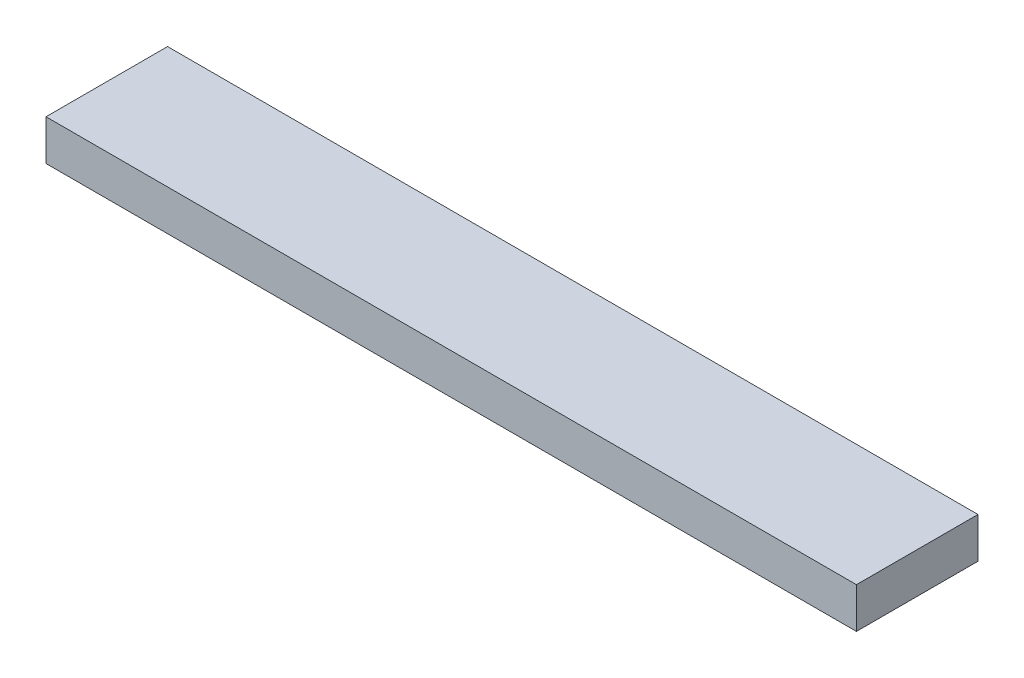
ISO-10303-21;
HEADER;
FILE_DESCRIPTION(('STEP AP214'),'2;1');
FILE_NAME('part.step','',(''),(''),'','','');
FILE_SCHEMA(('AUTOMOTIVE_DESIGN { 1 0 10303 214 1 1 1 1 }'));
ENDSEC;
DATA;
#1=APPLICATION_CONTEXT('core data for automotive mechanical design processes');
#2=APPLICATION_PROTOCOL_DEFINITION('international standard','automotive_design',2000,#1);
#3=PRODUCT_CONTEXT('',#1,'mechanical');
#4=PRODUCT('Part','Part','',(#3));
#5=PRODUCT_RELATED_PRODUCT_CATEGORY('part','',(#4));
#6=PRODUCT_DEFINITION_FORMATION('','',#4);
#7=PRODUCT_DEFINITION_CONTEXT('part definition',#1,'design');
#8=PRODUCT_DEFINITION('design','',#6,#7);
#9=PRODUCT_DEFINITION_SHAPE('','',#8);
#10=(LENGTH_UNIT() NAMED_UNIT(*) SI_UNIT(.MILLI.,.METRE.));
#11=(NAMED_UNIT(*) PLANE_ANGLE_UNIT() SI_UNIT($,.RADIAN.));
#12=(NAMED_UNIT(*) SI_UNIT($,.STERADIAN.) SOLID_ANGLE_UNIT());
#13=UNCERTAINTY_MEASURE_WITH_UNIT(LENGTH_MEASURE(1.E-05),#10,'distance_accuracy_value','');
#14=(GEOMETRIC_REPRESENTATION_CONTEXT(3) GLOBAL_UNCERTAINTY_ASSIGNED_CONTEXT((#13)) GLOBAL_UNIT_ASSIGNED_CONTEXT((#10,
#11,#12)) REPRESENTATION_CONTEXT('',''));
#15=CARTESIAN_POINT('',(0.,0.,0.));
#16=DIRECTION('',(0.,0.,1.));
#17=DIRECTION('',(1.,0.,0.));
#18=AXIS2_PLACEMENT_3D('',#15,#16,#17);
#19=CARTESIAN_POINT('',(500.,50.,75.));
#20=DIRECTION('',(-1.,0.,0.));
#21=DIRECTION('',(0.,0.,1.));
#22=AXIS2_PLACEMENT_3D('',#19,#20,#21);
#23=PLANE('',#22);
#24=DIRECTION('',(0.,0.,-1.));
#25=VECTOR('',#24,1.);
#26=CARTESIAN_POINT('',(500.,0.,75.));
#27=LINE('',#26,#25);
#28=CARTESIAN_POINT('',(500.,0.,75.));
#29=VERTEX_POINT('',#28);
#30=CARTESIAN_POINT('',(500.,0.,-75.));
#31=VERTEX_POINT('',#30);
#32=EDGE_CURVE('E96',#29,#31,#27,.T.);
#33=ORIENTED_EDGE('',*,*,#32,.T.);
#34=DIRECTION('',(0.,-1.,0.));
#35=VECTOR('',#34,1.);
#36=CARTESIAN_POINT('',(500.,50.,-75.));
#37=LINE('',#36,#35);
#38=CARTESIAN_POINT('',(500.,50.,-75.));
#39=VERTEX_POINT('',#38);
#40=EDGE_CURVE('E11',#39,#31,#37,.T.);
#41=ORIENTED_EDGE('',*,*,#40,.F.);
#42=DIRECTION('',(0.,0.,-1.));
#43=VECTOR('',#42,1.);
#44=CARTESIAN_POINT('',(500.,50.,75.));
#45=LINE('',#44,#43);
#46=CARTESIAN_POINT('',(500.,50.,75.));
#47=VERTEX_POINT('',#46);
#48=EDGE_CURVE('E84',#47,#39,#45,.T.);
#49=ORIENTED_EDGE('',*,*,#48,.F.);
#50=DIRECTION('',(0.,-1.,0.));
#51=VECTOR('',#50,1.);
#52=CARTESIAN_POINT('',(500.,50.,75.));
#53=LINE('',#52,#51);
#54=EDGE_CURVE('E92',#47,#29,#53,.T.);
#55=ORIENTED_EDGE('',*,*,#54,.T.);
#56=EDGE_LOOP('',(#33,#41,#49,#55));
#57=FACE_BOUND('',#56,.T.);
#58=ADVANCED_FACE('F33',(#57),#23,.F.);
#59=CARTESIAN_POINT('',(-500.,50.,-75.));
#60=DIRECTION('',(0.,0.,1.));
#61=DIRECTION('',(1.,0.,0.));
#62=AXIS2_PLACEMENT_3D('',#59,#60,#61);
#63=PLANE('',#62);
#64=DIRECTION('',(-1.,0.,0.));
#65=VECTOR('',#64,1.);
#66=CARTESIAN_POINT('',(-500.,0.,-75.));
#67=LINE('',#66,#65);
#68=CARTESIAN_POINT('',(-500.,0.,-75.));
#69=VERTEX_POINT('',#68);
#70=EDGE_CURVE('E88',#31,#69,#67,.T.);
#71=ORIENTED_EDGE('',*,*,#70,.T.);
#72=DIRECTION('',(0.,-1.,0.));
#73=VECTOR('',#72,1.);
#74=CARTESIAN_POINT('',(-500.,50.,-75.));
#75=LINE('',#74,#73);
#76=CARTESIAN_POINT('',(-500.,50.,-75.));
#77=VERTEX_POINT('',#76);
#78=EDGE_CURVE('E41',#77,#69,#75,.T.);
#79=ORIENTED_EDGE('',*,*,#78,.F.);
#80=DIRECTION('',(-1.,0.,0.));
#81=VECTOR('',#80,1.);
#82=CARTESIAN_POINT('',(-500.,50.,-75.));
#83=LINE('',#82,#81);
#84=EDGE_CURVE('E79',#39,#77,#83,.T.);
#85=ORIENTED_EDGE('',*,*,#84,.F.);
#86=ORIENTED_EDGE('',*,*,#40,.T.);
#87=EDGE_LOOP('',(#71,#79,#85,#86));
#88=FACE_BOUND('',#87,.T.);
#89=ADVANCED_FACE('F87',(#88),#63,.F.);
#90=CARTESIAN_POINT('',(-500.,50.,75.));
#91=DIRECTION('',(1.,0.,0.));
#92=DIRECTION('',(0.,0.,-1.));
#93=AXIS2_PLACEMENT_3D('',#90,#91,#92);
#94=PLANE('',#93);
#95=DIRECTION('',(0.,0.,1.));
#96=VECTOR('',#95,1.);
#97=CARTESIAN_POINT('',(-500.,0.,75.));
#98=LINE('',#97,#96);
#99=CARTESIAN_POINT('',(-500.,0.,75.));
#100=VERTEX_POINT('',#99);
#101=EDGE_CURVE('E66',#69,#100,#98,.T.);
#102=ORIENTED_EDGE('',*,*,#101,.T.);
#103=DIRECTION('',(0.,-1.,0.));
#104=VECTOR('',#103,1.);
#105=CARTESIAN_POINT('',(-500.,50.,75.));
#106=LINE('',#105,#104);
#107=CARTESIAN_POINT('',(-500.,50.,75.));
#108=VERTEX_POINT('',#107);
#109=EDGE_CURVE('E89',#108,#100,#106,.T.);
#110=ORIENTED_EDGE('',*,*,#109,.F.);
#111=DIRECTION('',(0.,0.,1.));
#112=VECTOR('',#111,1.);
#113=CARTESIAN_POINT('',(-500.,50.,75.));
#114=LINE('',#113,#112);
#115=EDGE_CURVE('E82',#77,#108,#114,.T.);
#116=ORIENTED_EDGE('',*,*,#115,.F.);
#117=ORIENTED_EDGE('',*,*,#78,.T.);
#118=EDGE_LOOP('',(#102,#110,#116,#117));
#119=FACE_BOUND('',#118,.T.);
#120=ADVANCED_FACE('F90',(#119),#94,.F.);
#121=CARTESIAN_POINT('',(-500.,50.,75.));
#122=DIRECTION('',(0.,0.,-1.));
#123=DIRECTION('',(-1.,0.,0.));
#124=AXIS2_PLACEMENT_3D('',#121,#122,#123);
#125=PLANE('',#124);
#126=DIRECTION('',(1.,0.,0.));
#127=VECTOR('',#126,1.);
#128=CARTESIAN_POINT('',(-500.,0.,75.));
#129=LINE('',#128,#127);
#130=EDGE_CURVE('E72',#100,#29,#129,.T.);
#131=ORIENTED_EDGE('',*,*,#130,.T.);
#132=ORIENTED_EDGE('',*,*,#54,.F.);
#133=DIRECTION('',(1.,0.,0.));
#134=VECTOR('',#133,1.);
#135=CARTESIAN_POINT('',(-500.,50.,75.));
#136=LINE('',#135,#134);
#137=EDGE_CURVE('E49',#108,#47,#136,.T.);
#138=ORIENTED_EDGE('',*,*,#137,.F.);
#139=ORIENTED_EDGE('',*,*,#109,.T.);
#140=EDGE_LOOP('',(#131,#132,#138,#139));
#141=FACE_BOUND('',#140,.T.);
#142=ADVANCED_FACE('F103',(#141),#125,.F.);
#143=CARTESIAN_POINT('',(0.,50.,0.));
#144=DIRECTION('',(0.,-1.,0.));
#145=DIRECTION('',(0.,0.,-1.));
#146=AXIS2_PLACEMENT_3D('',#143,#144,#145);
#147=PLANE('',#146);
#148=ORIENTED_EDGE('',*,*,#48,.T.);
#149=ORIENTED_EDGE('',*,*,#84,.T.);
#150=ORIENTED_EDGE('',*,*,#115,.T.);
#151=ORIENTED_EDGE('',*,*,#137,.T.);
#152=EDGE_LOOP('',(#148,#149,#150,#151));
#153=FACE_BOUND('',#152,.T.);
#154=ADVANCED_FACE('F80',(#153),#147,.F.);
#155=CARTESIAN_POINT('',(0.,0.,0.));
#156=DIRECTION('',(0.,-1.,0.));
#157=DIRECTION('',(0.,0.,-1.));
#158=AXIS2_PLACEMENT_3D('',#155,#156,#157);
#159=PLANE('',#158);
#160=ORIENTED_EDGE('',*,*,#32,.F.);
#161=ORIENTED_EDGE('',*,*,#130,.F.);
#162=ORIENTED_EDGE('',*,*,#101,.F.);
#163=ORIENTED_EDGE('',*,*,#70,.F.);
#164=EDGE_LOOP('',(#160,#161,#162,#163));
#165=FACE_BOUND('',#164,.T.);
#166=ADVANCED_FACE('F106',(#165),#159,.T.);
#167=CLOSED_SHELL('',(#58,#89,#120,#142,#154,#166));
#168=MANIFOLD_SOLID_BREP('B2',#167);
#169=ADVANCED_BREP_SHAPE_REPRESENTATION('',(#18,#168),#14);
#170=SHAPE_DEFINITION_REPRESENTATION(#9,#169);
ENDSEC;
END-ISO-10303-21;
